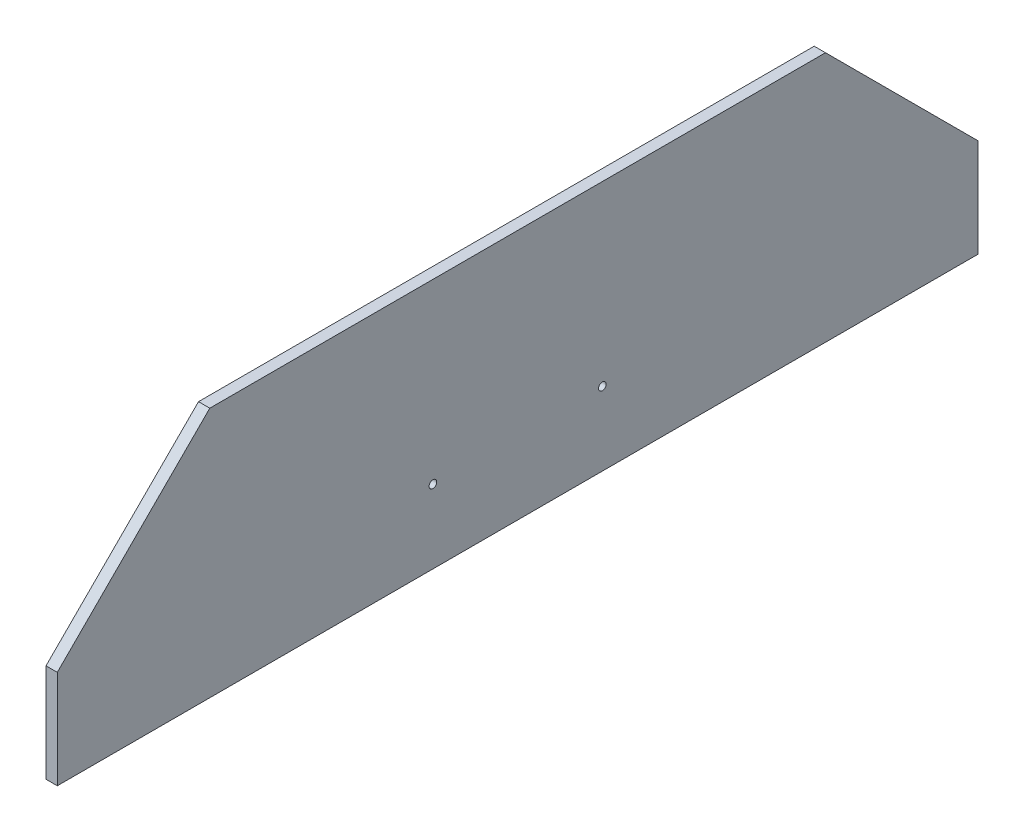
ISO-10303-21;
HEADER;
FILE_DESCRIPTION(('STEP AP214'),'2;1');
FILE_NAME('part.step','',(''),(''),'','','');
FILE_SCHEMA(('AUTOMOTIVE_DESIGN { 1 0 10303 214 1 1 1 1 }'));
ENDSEC;
DATA;
#1=APPLICATION_CONTEXT('core data for automotive mechanical design processes');
#2=APPLICATION_PROTOCOL_DEFINITION('international standard','automotive_design',2000,#1);
#3=PRODUCT_CONTEXT('',#1,'mechanical');
#4=PRODUCT('Part','Part','',(#3));
#5=PRODUCT_RELATED_PRODUCT_CATEGORY('part','',(#4));
#6=PRODUCT_DEFINITION_FORMATION('','',#4);
#7=PRODUCT_DEFINITION_CONTEXT('part definition',#1,'design');
#8=PRODUCT_DEFINITION('design','',#6,#7);
#9=PRODUCT_DEFINITION_SHAPE('','',#8);
#10=(LENGTH_UNIT() NAMED_UNIT(*) SI_UNIT(.MILLI.,.METRE.));
#11=(NAMED_UNIT(*) PLANE_ANGLE_UNIT() SI_UNIT($,.RADIAN.));
#12=(NAMED_UNIT(*) SI_UNIT($,.STERADIAN.) SOLID_ANGLE_UNIT());
#13=UNCERTAINTY_MEASURE_WITH_UNIT(LENGTH_MEASURE(1.E-05),#10,'distance_accuracy_value','');
#14=(GEOMETRIC_REPRESENTATION_CONTEXT(3) GLOBAL_UNCERTAINTY_ASSIGNED_CONTEXT((#13)) GLOBAL_UNIT_ASSIGNED_CONTEXT((#10,
#11,#12)) REPRESENTATION_CONTEXT('',''));
#15=CARTESIAN_POINT('',(0.,0.,0.));
#16=DIRECTION('',(0.,0.,1.));
#17=DIRECTION('',(1.,0.,0.));
#18=AXIS2_PLACEMENT_3D('',#15,#16,#17);
#19=CARTESIAN_POINT('',(0.,0.,0.));
#20=DIRECTION('',(-1.,0.,0.));
#21=DIRECTION('',(0.,0.,1.));
#22=AXIS2_PLACEMENT_3D('',#19,#20,#21);
#23=PLANE('',#22);
#24=DIRECTION('',(0.,0.,1.));
#25=VECTOR('',#24,1.);
#26=CARTESIAN_POINT('',(0.,222.,0.));
#27=LINE('',#26,#25);
#28=CARTESIAN_POINT('',(0.,222.,-680.));
#29=VERTEX_POINT('',#28);
#30=CARTESIAN_POINT('',(0.,222.,-135.000000000001));
#31=VERTEX_POINT('',#30);
#32=EDGE_CURVE('E94',#29,#31,#27,.T.);
#33=ORIENTED_EDGE('',*,*,#32,.F.);
#34=DIRECTION('',(0.,0.707106781186549,0.707106781186546));
#35=VECTOR('',#34,1.);
#36=CARTESIAN_POINT('',(0.,450.999999999999,-451.000000000001));
#37=LINE('',#36,#35);
#38=CARTESIAN_POINT('',(0.,86.9999999999993,-815.));
#39=VERTEX_POINT('',#38);
#40=EDGE_CURVE('E120',#29,#39,#37,.F.);
#41=ORIENTED_EDGE('',*,*,#40,.T.);
#42=DIRECTION('',(0.,1.,0.));
#43=VECTOR('',#42,1.);
#44=CARTESIAN_POINT('',(0.,0.,-815.));
#45=LINE('',#44,#43);
#46=CARTESIAN_POINT('',(0.,0.,-815.));
#47=VERTEX_POINT('',#46);
#48=EDGE_CURVE('E137',#47,#39,#45,.T.);
#49=ORIENTED_EDGE('',*,*,#48,.F.);
#50=DIRECTION('',(0.,0.,-1.));
#51=VECTOR('',#50,1.);
#52=CARTESIAN_POINT('',(0.,0.,0.));
#53=LINE('',#52,#51);
#54=CARTESIAN_POINT('',(0.,0.,0.));
#55=VERTEX_POINT('',#54);
#56=EDGE_CURVE('E139',#55,#47,#53,.T.);
#57=ORIENTED_EDGE('',*,*,#56,.F.);
#58=DIRECTION('',(0.,-1.,0.));
#59=VECTOR('',#58,1.);
#60=CARTESIAN_POINT('',(0.,0.,0.));
#61=LINE('',#60,#59);
#62=CARTESIAN_POINT('',(0.,86.9999999999999,0.));
#63=VERTEX_POINT('',#62);
#64=EDGE_CURVE('E106',#63,#55,#61,.T.);
#65=ORIENTED_EDGE('',*,*,#64,.F.);
#66=DIRECTION('',(0.,-0.707106781186546,0.707106781186549));
#67=VECTOR('',#66,1.);
#68=CARTESIAN_POINT('',(0.,43.5000000000001,43.4999999999999));
#69=LINE('',#68,#67);
#70=EDGE_CURVE('E118',#63,#31,#69,.F.);
#71=ORIENTED_EDGE('',*,*,#70,.T.);
#72=EDGE_LOOP('',(#33,#41,#49,#57,#65,#71));
#73=FACE_BOUND('',#72,.T.);
#74=CARTESIAN_POINT('',(0.,65.,-332.5));
#75=DIRECTION('',(1.,0.,0.));
#76=DIRECTION('',(0.,0.,-1.));
#77=AXIS2_PLACEMENT_3D('',#74,#75,#76);
#78=CIRCLE('',#77,3.3782);
#79=CARTESIAN_POINT('',(0.,65.,-335.8782));
#80=VERTEX_POINT('',#79);
#81=EDGE_CURVE('E143',#80,#80,#78,.T.);
#82=ORIENTED_EDGE('',*,*,#81,.T.);
#83=EDGE_LOOP('',(#82));
#84=FACE_BOUND('',#83,.T.);
#85=CARTESIAN_POINT('',(0.,65.,-482.5));
#86=DIRECTION('',(1.,0.,0.));
#87=DIRECTION('',(0.,0.,-1.));
#88=AXIS2_PLACEMENT_3D('',#85,#86,#87);
#89=CIRCLE('',#88,3.3782);
#90=CARTESIAN_POINT('',(0.,65.,-485.8782));
#91=VERTEX_POINT('',#90);
#92=EDGE_CURVE('E151',#91,#91,#89,.T.);
#93=ORIENTED_EDGE('',*,*,#92,.T.);
#94=EDGE_LOOP('',(#93));
#95=FACE_BOUND('',#94,.T.);
#96=ADVANCED_FACE('F33',(#73,#84,#95),#23,.T.);
#97=CARTESIAN_POINT('',(10.,0.,0.));
#98=DIRECTION('',(0.,0.,-1.));
#99=DIRECTION('',(-1.,0.,0.));
#100=AXIS2_PLACEMENT_3D('',#97,#98,#99);
#101=PLANE('',#100);
#102=DIRECTION('',(0.,-1.,0.));
#103=VECTOR('',#102,1.);
#104=CARTESIAN_POINT('',(10.,0.,0.));
#105=LINE('',#104,#103);
#106=CARTESIAN_POINT('',(10.,86.9999999999999,0.));
#107=VERTEX_POINT('',#106);
#108=CARTESIAN_POINT('',(10.,0.,0.));
#109=VERTEX_POINT('',#108);
#110=EDGE_CURVE('E86',#107,#109,#105,.T.);
#111=ORIENTED_EDGE('',*,*,#110,.F.);
#112=DIRECTION('',(-1.,0.,0.));
#113=VECTOR('',#112,1.);
#114=CARTESIAN_POINT('',(10.,86.9999999999999,0.));
#115=LINE('',#114,#113);
#116=EDGE_CURVE('E11',#107,#63,#115,.T.);
#117=ORIENTED_EDGE('',*,*,#116,.T.);
#118=ORIENTED_EDGE('',*,*,#64,.T.);
#119=DIRECTION('',(-1.,0.,0.));
#120=VECTOR('',#119,1.);
#121=CARTESIAN_POINT('',(10.,0.,0.));
#122=LINE('',#121,#120);
#123=EDGE_CURVE('E99',#109,#55,#122,.T.);
#124=ORIENTED_EDGE('',*,*,#123,.F.);
#125=EDGE_LOOP('',(#111,#117,#118,#124));
#126=FACE_BOUND('',#125,.T.);
#127=ADVANCED_FACE('F104',(#126),#101,.F.);
#128=CARTESIAN_POINT('',(10.,0.,0.));
#129=DIRECTION('',(0.,1.,0.));
#130=DIRECTION('',(0.,0.,1.));
#131=AXIS2_PLACEMENT_3D('',#128,#129,#130);
#132=PLANE('',#131);
#133=ORIENTED_EDGE('',*,*,#56,.T.);
#134=DIRECTION('',(-1.,0.,0.));
#135=VECTOR('',#134,1.);
#136=CARTESIAN_POINT('',(10.,0.,-815.));
#137=LINE('',#136,#135);
#138=CARTESIAN_POINT('',(10.,0.,-815.));
#139=VERTEX_POINT('',#138);
#140=EDGE_CURVE('E101',#139,#47,#137,.T.);
#141=ORIENTED_EDGE('',*,*,#140,.F.);
#142=DIRECTION('',(0.,0.,-1.));
#143=VECTOR('',#142,1.);
#144=CARTESIAN_POINT('',(10.,0.,0.));
#145=LINE('',#144,#143);
#146=EDGE_CURVE('E89',#109,#139,#145,.T.);
#147=ORIENTED_EDGE('',*,*,#146,.F.);
#148=ORIENTED_EDGE('',*,*,#123,.T.);
#149=EDGE_LOOP('',(#133,#141,#147,#148));
#150=FACE_BOUND('',#149,.T.);
#151=ADVANCED_FACE('F98',(#150),#132,.F.);
#152=CARTESIAN_POINT('',(10.,0.,-815.));
#153=DIRECTION('',(0.,0.,1.));
#154=DIRECTION('',(1.,0.,0.));
#155=AXIS2_PLACEMENT_3D('',#152,#153,#154);
#156=PLANE('',#155);
#157=ORIENTED_EDGE('',*,*,#48,.T.);
#158=DIRECTION('',(1.,0.,0.));
#159=VECTOR('',#158,1.);
#160=CARTESIAN_POINT('',(10.,86.9999999999993,-815.));
#161=LINE('',#160,#159);
#162=CARTESIAN_POINT('',(10.,86.9999999999993,-815.));
#163=VERTEX_POINT('',#162);
#164=EDGE_CURVE('E56',#39,#163,#161,.T.);
#165=ORIENTED_EDGE('',*,*,#164,.T.);
#166=DIRECTION('',(0.,1.,0.));
#167=VECTOR('',#166,1.);
#168=CARTESIAN_POINT('',(10.,0.,-815.));
#169=LINE('',#168,#167);
#170=EDGE_CURVE('E102',#139,#163,#169,.T.);
#171=ORIENTED_EDGE('',*,*,#170,.F.);
#172=ORIENTED_EDGE('',*,*,#140,.T.);
#173=EDGE_LOOP('',(#157,#165,#171,#172));
#174=FACE_BOUND('',#173,.T.);
#175=ADVANCED_FACE('F138',(#174),#156,.F.);
#176=CARTESIAN_POINT('',(10.,222.,0.));
#177=DIRECTION('',(0.,-1.,0.));
#178=DIRECTION('',(0.,0.,-1.));
#179=AXIS2_PLACEMENT_3D('',#176,#177,#178);
#180=PLANE('',#179);
#181=DIRECTION('',(0.,0.,1.));
#182=VECTOR('',#181,1.);
#183=CARTESIAN_POINT('',(10.,222.,0.));
#184=LINE('',#183,#182);
#185=CARTESIAN_POINT('',(10.,222.,-680.));
#186=VERTEX_POINT('',#185);
#187=CARTESIAN_POINT('',(10.,222.,-135.000000000001));
#188=VERTEX_POINT('',#187);
#189=EDGE_CURVE('E112',#186,#188,#184,.T.);
#190=ORIENTED_EDGE('',*,*,#189,.F.);
#191=DIRECTION('',(-1.,0.,0.));
#192=VECTOR('',#191,1.);
#193=CARTESIAN_POINT('',(10.,222.,-680.));
#194=LINE('',#193,#192);
#195=EDGE_CURVE('E110',#186,#29,#194,.T.);
#196=ORIENTED_EDGE('',*,*,#195,.T.);
#197=ORIENTED_EDGE('',*,*,#32,.T.);
#198=DIRECTION('',(1.,0.,0.));
#199=VECTOR('',#198,1.);
#200=CARTESIAN_POINT('',(10.,222.,-135.000000000001));
#201=LINE('',#200,#199);
#202=EDGE_CURVE('E108',#31,#188,#201,.T.);
#203=ORIENTED_EDGE('',*,*,#202,.T.);
#204=EDGE_LOOP('',(#190,#196,#197,#203));
#205=FACE_BOUND('',#204,.T.);
#206=ADVANCED_FACE('F128',(#205),#180,.F.);
#207=CARTESIAN_POINT('',(10.,0.,0.));
#208=DIRECTION('',(-1.,0.,0.));
#209=DIRECTION('',(0.,0.,1.));
#210=AXIS2_PLACEMENT_3D('',#207,#208,#209);
#211=PLANE('',#210);
#212=CARTESIAN_POINT('',(10.,65.,-482.5));
#213=DIRECTION('',(1.,0.,0.));
#214=DIRECTION('',(0.,0.,-1.));
#215=AXIS2_PLACEMENT_3D('',#212,#213,#214);
#216=CIRCLE('',#215,3.3782);
#217=CARTESIAN_POINT('',(10.,65.,-485.8782));
#218=VERTEX_POINT('',#217);
#219=EDGE_CURVE('E154',#218,#218,#216,.T.);
#220=ORIENTED_EDGE('',*,*,#219,.F.);
#221=EDGE_LOOP('',(#220));
#222=FACE_BOUND('',#221,.T.);
#223=CARTESIAN_POINT('',(10.,65.,-332.5));
#224=DIRECTION('',(1.,0.,0.));
#225=DIRECTION('',(0.,0.,-1.));
#226=AXIS2_PLACEMENT_3D('',#223,#224,#225);
#227=CIRCLE('',#226,3.3782);
#228=CARTESIAN_POINT('',(10.,65.,-335.8782));
#229=VERTEX_POINT('',#228);
#230=EDGE_CURVE('E148',#229,#229,#227,.T.);
#231=ORIENTED_EDGE('',*,*,#230,.F.);
#232=EDGE_LOOP('',(#231));
#233=FACE_BOUND('',#232,.T.);
#234=ORIENTED_EDGE('',*,*,#170,.T.);
#235=DIRECTION('',(0.,-0.707106781186549,-0.707106781186546));
#236=VECTOR('',#235,1.);
#237=CARTESIAN_POINT('',(10.,222.,-680.));
#238=LINE('',#237,#236);
#239=EDGE_CURVE('E41',#163,#186,#238,.F.);
#240=ORIENTED_EDGE('',*,*,#239,.T.);
#241=ORIENTED_EDGE('',*,*,#189,.T.);
#242=DIRECTION('',(0.,0.707106781186546,-0.707106781186549));
#243=VECTOR('',#242,1.);
#244=CARTESIAN_POINT('',(10.,86.9999999999999,0.));
#245=LINE('',#244,#243);
#246=EDGE_CURVE('E48',#188,#107,#245,.F.);
#247=ORIENTED_EDGE('',*,*,#246,.T.);
#248=ORIENTED_EDGE('',*,*,#110,.T.);
#249=ORIENTED_EDGE('',*,*,#146,.T.);
#250=EDGE_LOOP('',(#234,#240,#241,#247,#248,#249));
#251=FACE_BOUND('',#250,.T.);
#252=ADVANCED_FACE('F88',(#222,#233,#251),#211,.F.);
#253=CARTESIAN_POINT('',(10.,222.,-680.));
#254=DIRECTION('',(0.,-0.707106781186546,0.707106781186549));
#255=DIRECTION('',(-1.,0.,0.));
#256=AXIS2_PLACEMENT_3D('',#253,#254,#255);
#257=PLANE('',#256);
#258=ORIENTED_EDGE('',*,*,#239,.F.);
#259=ORIENTED_EDGE('',*,*,#164,.F.);
#260=ORIENTED_EDGE('',*,*,#40,.F.);
#261=ORIENTED_EDGE('',*,*,#195,.F.);
#262=EDGE_LOOP('',(#258,#259,#260,#261));
#263=FACE_BOUND('',#262,.T.);
#264=ADVANCED_FACE('F133',(#263),#257,.F.);
#265=CARTESIAN_POINT('',(10.,86.9999999999999,0.));
#266=DIRECTION('',(0.,-0.707106781186549,-0.707106781186546));
#267=DIRECTION('',(-1.,0.,0.));
#268=AXIS2_PLACEMENT_3D('',#265,#266,#267);
#269=PLANE('',#268);
#270=ORIENTED_EDGE('',*,*,#246,.F.);
#271=ORIENTED_EDGE('',*,*,#202,.F.);
#272=ORIENTED_EDGE('',*,*,#70,.F.);
#273=ORIENTED_EDGE('',*,*,#116,.F.);
#274=EDGE_LOOP('',(#270,#271,#272,#273));
#275=FACE_BOUND('',#274,.T.);
#276=ADVANCED_FACE('F35',(#275),#269,.F.);
#277=CARTESIAN_POINT('',(10.,65.,-332.5));
#278=DIRECTION('',(1.,0.,0.));
#279=DIRECTION('',(0.,0.,-1.));
#280=AXIS2_PLACEMENT_3D('',#277,#278,#279);
#281=CYLINDRICAL_SURFACE('',#280,3.3782);
#282=ORIENTED_EDGE('',*,*,#81,.F.);
#283=EDGE_LOOP('',(#282));
#284=FACE_BOUND('',#283,.T.);
#285=ORIENTED_EDGE('',*,*,#230,.T.);
#286=EDGE_LOOP('',(#285));
#287=FACE_BOUND('',#286,.T.);
#288=ADVANCED_FACE('F165',(#284,#287),#281,.F.);
#289=CARTESIAN_POINT('',(10.,65.,-482.5));
#290=DIRECTION('',(1.,0.,0.));
#291=DIRECTION('',(0.,0.,-1.));
#292=AXIS2_PLACEMENT_3D('',#289,#290,#291);
#293=CYLINDRICAL_SURFACE('',#292,3.3782);
#294=ORIENTED_EDGE('',*,*,#92,.F.);
#295=EDGE_LOOP('',(#294));
#296=FACE_BOUND('',#295,.T.);
#297=ORIENTED_EDGE('',*,*,#219,.T.);
#298=EDGE_LOOP('',(#297));
#299=FACE_BOUND('',#298,.T.);
#300=ADVANCED_FACE('F158',(#296,#299),#293,.F.);
#301=CLOSED_SHELL('',(#96,#127,#151,#175,#206,#252,#264,#276,#288,#300));
#302=MANIFOLD_SOLID_BREP('B2',#301);
#303=ADVANCED_BREP_SHAPE_REPRESENTATION('',(#18,#302),#14);
#304=SHAPE_DEFINITION_REPRESENTATION(#9,#303);
ENDSEC;
END-ISO-10303-21;
